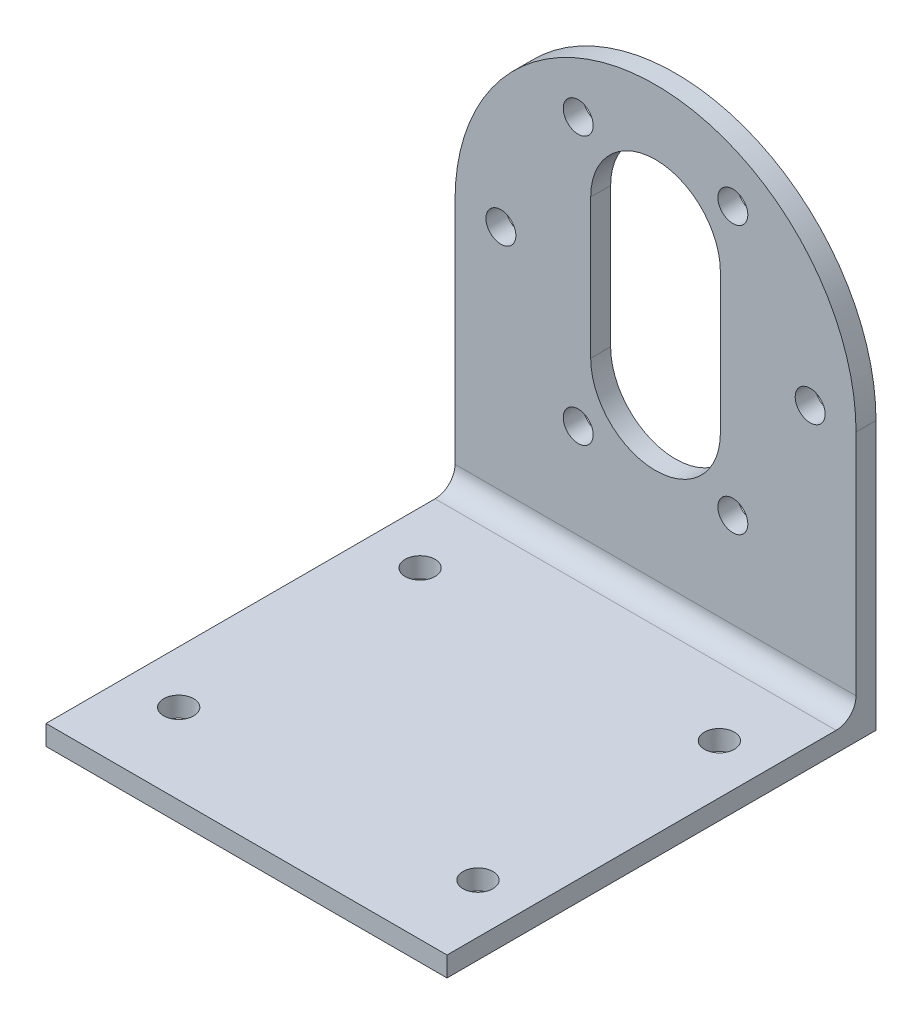
ISO-10303-21;
HEADER;
FILE_DESCRIPTION(('STEP AP214'),'2;1');
FILE_NAME('part.step','',(''),(''),'','','');
FILE_SCHEMA(('AUTOMOTIVE_DESIGN { 1 0 10303 214 1 1 1 1 }'));
ENDSEC;
DATA;
#1=APPLICATION_CONTEXT('core data for automotive mechanical design processes');
#2=APPLICATION_PROTOCOL_DEFINITION('international standard','automotive_design',2000,#1);
#3=PRODUCT_CONTEXT('',#1,'mechanical');
#4=PRODUCT('Part','Part','',(#3));
#5=PRODUCT_RELATED_PRODUCT_CATEGORY('part','',(#4));
#6=PRODUCT_DEFINITION_FORMATION('','',#4);
#7=PRODUCT_DEFINITION_CONTEXT('part definition',#1,'design');
#8=PRODUCT_DEFINITION('design','',#6,#7);
#9=PRODUCT_DEFINITION_SHAPE('','',#8);
#10=(LENGTH_UNIT() NAMED_UNIT(*) SI_UNIT(.MILLI.,.METRE.));
#11=(NAMED_UNIT(*) PLANE_ANGLE_UNIT() SI_UNIT($,.RADIAN.));
#12=(NAMED_UNIT(*) SI_UNIT($,.STERADIAN.) SOLID_ANGLE_UNIT());
#13=UNCERTAINTY_MEASURE_WITH_UNIT(LENGTH_MEASURE(1.E-05),#10,'distance_accuracy_value','');
#14=(GEOMETRIC_REPRESENTATION_CONTEXT(3) GLOBAL_UNCERTAINTY_ASSIGNED_CONTEXT((#13)) GLOBAL_UNIT_ASSIGNED_CONTEXT((#10,
#11,#12)) REPRESENTATION_CONTEXT('',''));
#15=CARTESIAN_POINT('',(0.,0.,0.));
#16=DIRECTION('',(0.,0.,1.));
#17=DIRECTION('',(1.,0.,0.));
#18=AXIS2_PLACEMENT_3D('',#15,#16,#17);
#19=CARTESIAN_POINT('',(0.,-22.9,4.));
#20=DIRECTION('',(1.,0.,0.));
#21=DIRECTION('',(0.,0.,-1.));
#22=AXIS2_PLACEMENT_3D('',#19,#20,#21);
#23=CYLINDRICAL_SURFACE('',#22,2.);
#24=DIRECTION('',(1.,0.,0.));
#25=VECTOR('',#24,1.);
#26=CARTESIAN_POINT('',(0.,-22.9,2.));
#27=LINE('',#26,#25);
#28=CARTESIAN_POINT('',(-20.1,-22.9,2.));
#29=VERTEX_POINT('',#28);
#30=CARTESIAN_POINT('',(20.1,-22.9,2.));
#31=VERTEX_POINT('',#30);
#32=EDGE_CURVE('E136',#29,#31,#27,.T.);
#33=ORIENTED_EDGE('',*,*,#32,.F.);
#34=CARTESIAN_POINT('',(-20.1,-22.9,4.));
#35=DIRECTION('',(1.,0.,0.));
#36=DIRECTION('',(0.,0.,-1.));
#37=AXIS2_PLACEMENT_3D('',#34,#35,#36);
#38=CIRCLE('',#37,2.);
#39=CARTESIAN_POINT('',(-20.1,-24.9,4.));
#40=VERTEX_POINT('',#39);
#41=EDGE_CURVE('E117',#29,#40,#38,.F.);
#42=ORIENTED_EDGE('',*,*,#41,.T.);
#43=DIRECTION('',(1.,0.,0.));
#44=VECTOR('',#43,1.);
#45=CARTESIAN_POINT('',(0.,-24.9,4.));
#46=LINE('',#45,#44);
#47=CARTESIAN_POINT('',(20.1,-24.9,4.));
#48=VERTEX_POINT('',#47);
#49=EDGE_CURVE('E122',#48,#40,#46,.F.);
#50=ORIENTED_EDGE('',*,*,#49,.F.);
#51=CARTESIAN_POINT('',(20.1,-22.9,4.));
#52=DIRECTION('',(1.,0.,0.));
#53=DIRECTION('',(0.,0.,-1.));
#54=AXIS2_PLACEMENT_3D('',#51,#52,#53);
#55=CIRCLE('',#54,2.);
#56=EDGE_CURVE('E214',#48,#31,#55,.T.);
#57=ORIENTED_EDGE('',*,*,#56,.T.);
#58=EDGE_LOOP('',(#33,#42,#50,#57));
#59=FACE_BOUND('',#58,.T.);
#60=ADVANCED_FACE('F17',(#59),#23,.F.);
#61=CARTESIAN_POINT('',(0.,0.,2.));
#62=DIRECTION('',(0.,0.,1.));
#63=DIRECTION('',(1.,0.,0.));
#64=AXIS2_PLACEMENT_3D('',#61,#62,#63);
#65=PLANE('',#64);
#66=CARTESIAN_POINT('',(7.75000000000016,13.4233937586587,2.));
#67=DIRECTION('',(0.,0.,-1.));
#68=DIRECTION('',(-1.,0.,0.));
#69=AXIS2_PLACEMENT_3D('',#66,#67,#68);
#70=CIRCLE('',#69,1.5);
#71=CARTESIAN_POINT('',(6.25000000000016,13.4233937586587,2.));
#72=VERTEX_POINT('',#71);
#73=EDGE_CURVE('E124',#72,#72,#70,.T.);
#74=ORIENTED_EDGE('',*,*,#73,.T.);
#75=EDGE_LOOP('',(#74));
#76=FACE_BOUND('',#75,.T.);
#77=CARTESIAN_POINT('',(-15.5,1.08235921504137E-13,2.));
#78=DIRECTION('',(0.,0.,-1.));
#79=DIRECTION('',(-1.,0.,0.));
#80=AXIS2_PLACEMENT_3D('',#77,#78,#79);
#81=CIRCLE('',#80,1.5);
#82=CARTESIAN_POINT('',(-17.,1.08235921504137E-13,2.));
#83=VERTEX_POINT('',#82);
#84=EDGE_CURVE('E223',#83,#83,#81,.T.);
#85=ORIENTED_EDGE('',*,*,#84,.T.);
#86=EDGE_LOOP('',(#85));
#87=FACE_BOUND('',#86,.T.);
#88=CARTESIAN_POINT('',(7.74999999999997,-13.4233937586588,2.));
#89=DIRECTION('',(0.,0.,-1.));
#90=DIRECTION('',(-1.,0.,0.));
#91=AXIS2_PLACEMENT_3D('',#88,#89,#90);
#92=CIRCLE('',#91,1.5);
#93=CARTESIAN_POINT('',(6.24999999999997,-13.4233937586588,2.));
#94=VERTEX_POINT('',#93);
#95=EDGE_CURVE('E229',#94,#94,#92,.T.);
#96=ORIENTED_EDGE('',*,*,#95,.T.);
#97=EDGE_LOOP('',(#96));
#98=FACE_BOUND('',#97,.T.);
#99=CARTESIAN_POINT('',(15.5,0.,2.));
#100=DIRECTION('',(0.,0.,-1.));
#101=DIRECTION('',(-1.,0.,0.));
#102=AXIS2_PLACEMENT_3D('',#99,#100,#101);
#103=CIRCLE('',#102,1.5);
#104=CARTESIAN_POINT('',(14.,0.,2.));
#105=VERTEX_POINT('',#104);
#106=EDGE_CURVE('E20',#105,#105,#103,.T.);
#107=ORIENTED_EDGE('',*,*,#106,.T.);
#108=EDGE_LOOP('',(#107));
#109=FACE_BOUND('',#108,.T.);
#110=DIRECTION('',(0.,1.,0.));
#111=VECTOR('',#110,1.);
#112=CARTESIAN_POINT('',(6.5,7.1,2.));
#113=LINE('',#112,#111);
#114=CARTESIAN_POINT('',(6.5,-6.9,2.));
#115=VERTEX_POINT('',#114);
#116=CARTESIAN_POINT('',(6.5,7.1,2.));
#117=VERTEX_POINT('',#116);
#118=EDGE_CURVE('E107',#115,#117,#113,.T.);
#119=ORIENTED_EDGE('',*,*,#118,.F.);
#120=CARTESIAN_POINT('',(0.,-6.9,2.));
#121=DIRECTION('',(0.,0.,-1.));
#122=DIRECTION('',(-1.,0.,0.));
#123=AXIS2_PLACEMENT_3D('',#120,#121,#122);
#124=CIRCLE('',#123,6.5);
#125=CARTESIAN_POINT('',(-6.5,-6.9,2.));
#126=VERTEX_POINT('',#125);
#127=EDGE_CURVE('E164',#115,#126,#124,.T.);
#128=ORIENTED_EDGE('',*,*,#127,.T.);
#129=DIRECTION('',(0.,1.,0.));
#130=VECTOR('',#129,1.);
#131=CARTESIAN_POINT('',(-6.5,7.1,2.));
#132=LINE('',#131,#130);
#133=CARTESIAN_POINT('',(-6.5,7.1,2.));
#134=VERTEX_POINT('',#133);
#135=EDGE_CURVE('E162',#134,#126,#132,.F.);
#136=ORIENTED_EDGE('',*,*,#135,.F.);
#137=CARTESIAN_POINT('',(0.,7.1,2.));
#138=DIRECTION('',(0.,0.,-1.));
#139=DIRECTION('',(-1.,0.,0.));
#140=AXIS2_PLACEMENT_3D('',#137,#138,#139);
#141=CIRCLE('',#140,6.5);
#142=EDGE_CURVE('E233',#134,#117,#141,.T.);
#143=ORIENTED_EDGE('',*,*,#142,.T.);
#144=EDGE_LOOP('',(#119,#128,#136,#143));
#145=FACE_BOUND('',#144,.T.);
#146=CARTESIAN_POINT('',(-7.75000000000006,-13.4233937586588,2.));
#147=DIRECTION('',(0.,0.,-1.));
#148=DIRECTION('',(-1.,0.,0.));
#149=AXIS2_PLACEMENT_3D('',#146,#147,#148);
#150=CIRCLE('',#149,1.5);
#151=CARTESIAN_POINT('',(-9.25000000000007,-13.4233937586588,2.));
#152=VERTEX_POINT('',#151);
#153=EDGE_CURVE('E226',#152,#152,#150,.T.);
#154=ORIENTED_EDGE('',*,*,#153,.T.);
#155=EDGE_LOOP('',(#154));
#156=FACE_BOUND('',#155,.T.);
#157=CARTESIAN_POINT('',(-7.74999999999988,13.4233937586589,2.));
#158=DIRECTION('',(0.,0.,-1.));
#159=DIRECTION('',(-1.,0.,0.));
#160=AXIS2_PLACEMENT_3D('',#157,#158,#159);
#161=CIRCLE('',#160,1.5);
#162=CARTESIAN_POINT('',(-9.24999999999987,13.4233937586589,2.));
#163=VERTEX_POINT('',#162);
#164=EDGE_CURVE('E220',#163,#163,#161,.T.);
#165=ORIENTED_EDGE('',*,*,#164,.T.);
#166=EDGE_LOOP('',(#165));
#167=FACE_BOUND('',#166,.T.);
#168=DIRECTION('',(0.,1.,0.));
#169=VECTOR('',#168,1.);
#170=CARTESIAN_POINT('',(20.1,-26.9,2.));
#171=LINE('',#170,#169);
#172=CARTESIAN_POINT('',(20.1,0.,2.));
#173=VERTEX_POINT('',#172);
#174=EDGE_CURVE('E103',#31,#173,#171,.T.);
#175=ORIENTED_EDGE('',*,*,#174,.T.);
#176=CARTESIAN_POINT('',(0.,0.,2.));
#177=DIRECTION('',(0.,0.,-1.));
#178=DIRECTION('',(-1.,0.,0.));
#179=AXIS2_PLACEMENT_3D('',#176,#177,#178);
#180=CIRCLE('',#179,20.1);
#181=CARTESIAN_POINT('',(-20.1,0.,2.));
#182=VERTEX_POINT('',#181);
#183=EDGE_CURVE('E98',#182,#173,#180,.T.);
#184=ORIENTED_EDGE('',*,*,#183,.F.);
#185=DIRECTION('',(0.,1.,0.));
#186=VECTOR('',#185,1.);
#187=CARTESIAN_POINT('',(-20.1,-26.9,2.));
#188=LINE('',#187,#186);
#189=EDGE_CURVE('E101',#182,#29,#188,.F.);
#190=ORIENTED_EDGE('',*,*,#189,.T.);
#191=ORIENTED_EDGE('',*,*,#32,.T.);
#192=EDGE_LOOP('',(#175,#184,#190,#191));
#193=FACE_BOUND('',#192,.T.);
#194=ADVANCED_FACE('F100',(#76,#87,#98,#109,#145,#156,#167,#193),#65,.T.);
#195=CARTESIAN_POINT('',(15.5,0.,2.));
#196=DIRECTION('',(0.,0.,-1.));
#197=DIRECTION('',(-1.,0.,0.));
#198=AXIS2_PLACEMENT_3D('',#195,#196,#197);
#199=CYLINDRICAL_SURFACE('',#198,1.5);
#200=CARTESIAN_POINT('',(15.5,0.,0.));
#201=DIRECTION('',(0.,0.,-1.));
#202=DIRECTION('',(-1.,0.,0.));
#203=AXIS2_PLACEMENT_3D('',#200,#201,#202);
#204=CIRCLE('',#203,1.5);
#205=CARTESIAN_POINT('',(14.,0.,0.));
#206=VERTEX_POINT('',#205);
#207=EDGE_CURVE('E210',#206,#206,#204,.T.);
#208=ORIENTED_EDGE('',*,*,#207,.T.);
#209=EDGE_LOOP('',(#208));
#210=FACE_BOUND('',#209,.T.);
#211=ORIENTED_EDGE('',*,*,#106,.F.);
#212=EDGE_LOOP('',(#211));
#213=FACE_BOUND('',#212,.T.);
#214=ADVANCED_FACE('F273',(#210,#213),#199,.F.);
#215=CARTESIAN_POINT('',(0.,0.,2.));
#216=DIRECTION('',(0.,0.,-1.));
#217=DIRECTION('',(-1.,0.,0.));
#218=AXIS2_PLACEMENT_3D('',#215,#216,#217);
#219=CYLINDRICAL_SURFACE('',#218,20.1);
#220=ORIENTED_EDGE('',*,*,#183,.T.);
#221=DIRECTION('',(0.,0.,1.));
#222=VECTOR('',#221,1.);
#223=CARTESIAN_POINT('',(20.1,0.,2.));
#224=LINE('',#223,#222);
#225=CARTESIAN_POINT('',(20.1,0.,0.));
#226=VERTEX_POINT('',#225);
#227=EDGE_CURVE('E142',#173,#226,#224,.F.);
#228=ORIENTED_EDGE('',*,*,#227,.T.);
#229=CARTESIAN_POINT('',(0.,0.,0.));
#230=DIRECTION('',(0.,0.,-1.));
#231=DIRECTION('',(-1.,0.,0.));
#232=AXIS2_PLACEMENT_3D('',#229,#230,#231);
#233=CIRCLE('',#232,20.1);
#234=CARTESIAN_POINT('',(-20.1,0.,0.));
#235=VERTEX_POINT('',#234);
#236=EDGE_CURVE('E121',#226,#235,#233,.F.);
#237=ORIENTED_EDGE('',*,*,#236,.T.);
#238=DIRECTION('',(0.,0.,-1.));
#239=VECTOR('',#238,1.);
#240=CARTESIAN_POINT('',(-20.1,0.,2.));
#241=LINE('',#240,#239);
#242=EDGE_CURVE('E113',#235,#182,#241,.F.);
#243=ORIENTED_EDGE('',*,*,#242,.T.);
#244=EDGE_LOOP('',(#220,#228,#237,#243));
#245=FACE_BOUND('',#244,.T.);
#246=ADVANCED_FACE('F120',(#245),#219,.T.);
#247=CARTESIAN_POINT('',(6.5,7.1,2.));
#248=DIRECTION('',(-1.,0.,0.));
#249=DIRECTION('',(0.,0.,1.));
#250=AXIS2_PLACEMENT_3D('',#247,#248,#249);
#251=PLANE('',#250);
#252=ORIENTED_EDGE('',*,*,#118,.T.);
#253=DIRECTION('',(0.,0.,-1.));
#254=VECTOR('',#253,1.);
#255=CARTESIAN_POINT('',(6.5,7.1,2.));
#256=LINE('',#255,#254);
#257=CARTESIAN_POINT('',(6.5,7.1,0.));
#258=VERTEX_POINT('',#257);
#259=EDGE_CURVE('E232',#117,#258,#256,.T.);
#260=ORIENTED_EDGE('',*,*,#259,.T.);
#261=DIRECTION('',(0.,1.,0.));
#262=VECTOR('',#261,1.);
#263=CARTESIAN_POINT('',(6.5,0.,0.));
#264=LINE('',#263,#262);
#265=CARTESIAN_POINT('',(6.5,-6.9,0.));
#266=VERTEX_POINT('',#265);
#267=EDGE_CURVE('E208',#258,#266,#264,.F.);
#268=ORIENTED_EDGE('',*,*,#267,.T.);
#269=DIRECTION('',(0.,0.,-1.));
#270=VECTOR('',#269,1.);
#271=CARTESIAN_POINT('',(6.5,-6.9,2.));
#272=LINE('',#271,#270);
#273=EDGE_CURVE('E161',#266,#115,#272,.F.);
#274=ORIENTED_EDGE('',*,*,#273,.T.);
#275=EDGE_LOOP('',(#252,#260,#268,#274));
#276=FACE_BOUND('',#275,.T.);
#277=ADVANCED_FACE('F375',(#276),#251,.T.);
#278=CARTESIAN_POINT('',(0.,-6.9,2.));
#279=DIRECTION('',(0.,0.,-1.));
#280=DIRECTION('',(-1.,0.,0.));
#281=AXIS2_PLACEMENT_3D('',#278,#279,#280);
#282=CYLINDRICAL_SURFACE('',#281,6.5);
#283=DIRECTION('',(0.,0.,-1.));
#284=VECTOR('',#283,1.);
#285=CARTESIAN_POINT('',(-6.5,-6.9,2.));
#286=LINE('',#285,#284);
#287=CARTESIAN_POINT('',(-6.5,-6.9,0.));
#288=VERTEX_POINT('',#287);
#289=EDGE_CURVE('E163',#126,#288,#286,.T.);
#290=ORIENTED_EDGE('',*,*,#289,.F.);
#291=ORIENTED_EDGE('',*,*,#127,.F.);
#292=ORIENTED_EDGE('',*,*,#273,.F.);
#293=CARTESIAN_POINT('',(0.,-6.9,0.));
#294=DIRECTION('',(0.,0.,-1.));
#295=DIRECTION('',(-1.,0.,0.));
#296=AXIS2_PLACEMENT_3D('',#293,#294,#295);
#297=CIRCLE('',#296,6.5);
#298=EDGE_CURVE('E205',#266,#288,#297,.T.);
#299=ORIENTED_EDGE('',*,*,#298,.T.);
#300=EDGE_LOOP('',(#290,#291,#292,#299));
#301=FACE_BOUND('',#300,.T.);
#302=ADVANCED_FACE('F373',(#301),#282,.F.);
#303=CARTESIAN_POINT('',(-6.5,7.1,2.));
#304=DIRECTION('',(1.,0.,0.));
#305=DIRECTION('',(0.,0.,-1.));
#306=AXIS2_PLACEMENT_3D('',#303,#304,#305);
#307=PLANE('',#306);
#308=ORIENTED_EDGE('',*,*,#135,.T.);
#309=ORIENTED_EDGE('',*,*,#289,.T.);
#310=DIRECTION('',(0.,1.,0.));
#311=VECTOR('',#310,1.);
#312=CARTESIAN_POINT('',(-6.5,0.,0.));
#313=LINE('',#312,#311);
#314=CARTESIAN_POINT('',(-6.5,7.1,0.));
#315=VERTEX_POINT('',#314);
#316=EDGE_CURVE('E204',#288,#315,#313,.T.);
#317=ORIENTED_EDGE('',*,*,#316,.T.);
#318=DIRECTION('',(0.,0.,-1.));
#319=VECTOR('',#318,1.);
#320=CARTESIAN_POINT('',(-6.5,7.1,2.));
#321=LINE('',#320,#319);
#322=EDGE_CURVE('E236',#315,#134,#321,.F.);
#323=ORIENTED_EDGE('',*,*,#322,.T.);
#324=EDGE_LOOP('',(#308,#309,#317,#323));
#325=FACE_BOUND('',#324,.T.);
#326=ADVANCED_FACE('F367',(#325),#307,.T.);
#327=CARTESIAN_POINT('',(0.,7.1,2.));
#328=DIRECTION('',(0.,0.,-1.));
#329=DIRECTION('',(-1.,0.,0.));
#330=AXIS2_PLACEMENT_3D('',#327,#328,#329);
#331=CYLINDRICAL_SURFACE('',#330,6.5);
#332=ORIENTED_EDGE('',*,*,#259,.F.);
#333=ORIENTED_EDGE('',*,*,#142,.F.);
#334=ORIENTED_EDGE('',*,*,#322,.F.);
#335=CARTESIAN_POINT('',(0.,7.1,0.));
#336=DIRECTION('',(0.,0.,-1.));
#337=DIRECTION('',(-1.,0.,0.));
#338=AXIS2_PLACEMENT_3D('',#335,#336,#337);
#339=CIRCLE('',#338,6.5);
#340=EDGE_CURVE('E201',#315,#258,#339,.T.);
#341=ORIENTED_EDGE('',*,*,#340,.T.);
#342=EDGE_LOOP('',(#332,#333,#334,#341));
#343=FACE_BOUND('',#342,.T.);
#344=ADVANCED_FACE('F381',(#343),#331,.F.);
#345=CARTESIAN_POINT('',(7.74999999999997,-13.4233937586588,2.));
#346=DIRECTION('',(0.,0.,-1.));
#347=DIRECTION('',(-1.,0.,0.));
#348=AXIS2_PLACEMENT_3D('',#345,#346,#347);
#349=CYLINDRICAL_SURFACE('',#348,1.5);
#350=CARTESIAN_POINT('',(7.74999999999997,-13.4233937586588,0.));
#351=DIRECTION('',(0.,0.,-1.));
#352=DIRECTION('',(-1.,0.,0.));
#353=AXIS2_PLACEMENT_3D('',#350,#351,#352);
#354=CIRCLE('',#353,1.5);
#355=CARTESIAN_POINT('',(6.24999999999997,-13.4233937586588,0.));
#356=VERTEX_POINT('',#355);
#357=EDGE_CURVE('E198',#356,#356,#354,.T.);
#358=ORIENTED_EDGE('',*,*,#357,.T.);
#359=EDGE_LOOP('',(#358));
#360=FACE_BOUND('',#359,.T.);
#361=ORIENTED_EDGE('',*,*,#95,.F.);
#362=EDGE_LOOP('',(#361));
#363=FACE_BOUND('',#362,.T.);
#364=ADVANCED_FACE('F419',(#360,#363),#349,.F.);
#365=CARTESIAN_POINT('',(-7.75000000000006,-13.4233937586588,2.));
#366=DIRECTION('',(0.,0.,-1.));
#367=DIRECTION('',(-1.,0.,0.));
#368=AXIS2_PLACEMENT_3D('',#365,#366,#367);
#369=CYLINDRICAL_SURFACE('',#368,1.5);
#370=CARTESIAN_POINT('',(-7.75000000000006,-13.4233937586588,0.));
#371=DIRECTION('',(0.,0.,-1.));
#372=DIRECTION('',(-1.,0.,0.));
#373=AXIS2_PLACEMENT_3D('',#370,#371,#372);
#374=CIRCLE('',#373,1.5);
#375=CARTESIAN_POINT('',(-9.25000000000007,-13.4233937586588,0.));
#376=VERTEX_POINT('',#375);
#377=EDGE_CURVE('E195',#376,#376,#374,.T.);
#378=ORIENTED_EDGE('',*,*,#377,.T.);
#379=EDGE_LOOP('',(#378));
#380=FACE_BOUND('',#379,.T.);
#381=ORIENTED_EDGE('',*,*,#153,.F.);
#382=EDGE_LOOP('',(#381));
#383=FACE_BOUND('',#382,.T.);
#384=ADVANCED_FACE('F301',(#380,#383),#369,.F.);
#385=CARTESIAN_POINT('',(-15.5,1.08235921504137E-13,2.));
#386=DIRECTION('',(0.,0.,-1.));
#387=DIRECTION('',(-1.,0.,0.));
#388=AXIS2_PLACEMENT_3D('',#385,#386,#387);
#389=CYLINDRICAL_SURFACE('',#388,1.5);
#390=CARTESIAN_POINT('',(-15.5,1.08235921504137E-13,0.));
#391=DIRECTION('',(0.,0.,-1.));
#392=DIRECTION('',(-1.,0.,0.));
#393=AXIS2_PLACEMENT_3D('',#390,#391,#392);
#394=CIRCLE('',#393,1.5);
#395=CARTESIAN_POINT('',(-17.,1.08235921504137E-13,0.));
#396=VERTEX_POINT('',#395);
#397=EDGE_CURVE('E192',#396,#396,#394,.T.);
#398=ORIENTED_EDGE('',*,*,#397,.T.);
#399=EDGE_LOOP('',(#398));
#400=FACE_BOUND('',#399,.T.);
#401=ORIENTED_EDGE('',*,*,#84,.F.);
#402=EDGE_LOOP('',(#401));
#403=FACE_BOUND('',#402,.T.);
#404=ADVANCED_FACE('F290',(#400,#403),#389,.F.);
#405=CARTESIAN_POINT('',(-7.74999999999988,13.4233937586589,2.));
#406=DIRECTION('',(0.,0.,-1.));
#407=DIRECTION('',(-1.,0.,0.));
#408=AXIS2_PLACEMENT_3D('',#405,#406,#407);
#409=CYLINDRICAL_SURFACE('',#408,1.5);
#410=CARTESIAN_POINT('',(-7.74999999999988,13.4233937586589,0.));
#411=DIRECTION('',(0.,0.,-1.));
#412=DIRECTION('',(-1.,0.,0.));
#413=AXIS2_PLACEMENT_3D('',#410,#411,#412);
#414=CIRCLE('',#413,1.5);
#415=CARTESIAN_POINT('',(-9.24999999999987,13.4233937586589,0.));
#416=VERTEX_POINT('',#415);
#417=EDGE_CURVE('E189',#416,#416,#414,.T.);
#418=ORIENTED_EDGE('',*,*,#417,.T.);
#419=EDGE_LOOP('',(#418));
#420=FACE_BOUND('',#419,.T.);
#421=ORIENTED_EDGE('',*,*,#164,.F.);
#422=EDGE_LOOP('',(#421));
#423=FACE_BOUND('',#422,.T.);
#424=ADVANCED_FACE('F287',(#420,#423),#409,.F.);
#425=CARTESIAN_POINT('',(7.75000000000016,13.4233937586587,2.));
#426=DIRECTION('',(0.,0.,-1.));
#427=DIRECTION('',(-1.,0.,0.));
#428=AXIS2_PLACEMENT_3D('',#425,#426,#427);
#429=CYLINDRICAL_SURFACE('',#428,1.5);
#430=CARTESIAN_POINT('',(7.75000000000016,13.4233937586587,0.));
#431=DIRECTION('',(0.,0.,-1.));
#432=DIRECTION('',(-1.,0.,0.));
#433=AXIS2_PLACEMENT_3D('',#430,#431,#432);
#434=CIRCLE('',#433,1.5);
#435=CARTESIAN_POINT('',(6.25000000000016,13.4233937586587,0.));
#436=VERTEX_POINT('',#435);
#437=EDGE_CURVE('E186',#436,#436,#434,.T.);
#438=ORIENTED_EDGE('',*,*,#437,.T.);
#439=EDGE_LOOP('',(#438));
#440=FACE_BOUND('',#439,.T.);
#441=ORIENTED_EDGE('',*,*,#73,.F.);
#442=EDGE_LOOP('',(#441));
#443=FACE_BOUND('',#442,.T.);
#444=ADVANCED_FACE('F289',(#440,#443),#429,.F.);
#445=CARTESIAN_POINT('',(0.,-24.9,0.));
#446=DIRECTION('',(0.,1.,0.));
#447=DIRECTION('',(0.,0.,1.));
#448=AXIS2_PLACEMENT_3D('',#445,#446,#447);
#449=PLANE('',#448);
#450=DIRECTION('',(0.,0.,-1.));
#451=VECTOR('',#450,1.);
#452=CARTESIAN_POINT('',(-20.1,-24.9,2.));
#453=LINE('',#452,#451);
#454=CARTESIAN_POINT('',(-20.1,-24.9,43.));
#455=VERTEX_POINT('',#454);
#456=EDGE_CURVE('E148',#40,#455,#453,.F.);
#457=ORIENTED_EDGE('',*,*,#456,.T.);
#458=DIRECTION('',(1.,0.,0.));
#459=VECTOR('',#458,1.);
#460=CARTESIAN_POINT('',(-20.1,-24.9,43.));
#461=LINE('',#460,#459);
#462=CARTESIAN_POINT('',(20.1,-24.9,43.));
#463=VERTEX_POINT('',#462);
#464=EDGE_CURVE('E145',#463,#455,#461,.F.);
#465=ORIENTED_EDGE('',*,*,#464,.F.);
#466=DIRECTION('',(0.,0.,1.));
#467=VECTOR('',#466,1.);
#468=CARTESIAN_POINT('',(20.1,-24.9,2.));
#469=LINE('',#468,#467);
#470=EDGE_CURVE('E141',#463,#48,#469,.F.);
#471=ORIENTED_EDGE('',*,*,#470,.T.);
#472=ORIENTED_EDGE('',*,*,#49,.T.);
#473=EDGE_LOOP('',(#457,#465,#471,#472));
#474=FACE_BOUND('',#473,.T.);
#475=CARTESIAN_POINT('',(-14.85,-24.9,34.95));
#476=DIRECTION('',(0.,-1.,0.));
#477=DIRECTION('',(0.,0.,-1.));
#478=AXIS2_PLACEMENT_3D('',#475,#476,#477);
#479=CIRCLE('',#478,1.5);
#480=CARTESIAN_POINT('',(-14.85,-24.9,33.45));
#481=VERTEX_POINT('',#480);
#482=EDGE_CURVE('E133',#481,#481,#479,.T.);
#483=ORIENTED_EDGE('',*,*,#482,.T.);
#484=EDGE_LOOP('',(#483));
#485=FACE_BOUND('',#484,.T.);
#486=CARTESIAN_POINT('',(15.15,-24.9,34.95));
#487=DIRECTION('',(0.,-1.,0.));
#488=DIRECTION('',(0.,0.,-1.));
#489=AXIS2_PLACEMENT_3D('',#486,#487,#488);
#490=CIRCLE('',#489,1.5);
#491=CARTESIAN_POINT('',(15.15,-24.9,33.45));
#492=VERTEX_POINT('',#491);
#493=EDGE_CURVE('E177',#492,#492,#490,.T.);
#494=ORIENTED_EDGE('',*,*,#493,.T.);
#495=EDGE_LOOP('',(#494));
#496=FACE_BOUND('',#495,.T.);
#497=CARTESIAN_POINT('',(15.15,-24.9,10.75));
#498=DIRECTION('',(0.,-1.,0.));
#499=DIRECTION('',(0.,0.,-1.));
#500=AXIS2_PLACEMENT_3D('',#497,#498,#499);
#501=CIRCLE('',#500,1.5);
#502=CARTESIAN_POINT('',(15.15,-24.9,9.25));
#503=VERTEX_POINT('',#502);
#504=EDGE_CURVE('E180',#503,#503,#501,.T.);
#505=ORIENTED_EDGE('',*,*,#504,.T.);
#506=EDGE_LOOP('',(#505));
#507=FACE_BOUND('',#506,.T.);
#508=CARTESIAN_POINT('',(-14.85,-24.9,10.75));
#509=DIRECTION('',(0.,-1.,0.));
#510=DIRECTION('',(0.,0.,-1.));
#511=AXIS2_PLACEMENT_3D('',#508,#509,#510);
#512=CIRCLE('',#511,1.5);
#513=CARTESIAN_POINT('',(-14.85,-24.9,9.25));
#514=VERTEX_POINT('',#513);
#515=EDGE_CURVE('E183',#514,#514,#512,.T.);
#516=ORIENTED_EDGE('',*,*,#515,.T.);
#517=EDGE_LOOP('',(#516));
#518=FACE_BOUND('',#517,.T.);
#519=ADVANCED_FACE('F298',(#474,#485,#496,#507,#518),#449,.T.);
#520=CARTESIAN_POINT('',(-20.1,-26.9,2.));
#521=DIRECTION('',(1.,0.,0.));
#522=DIRECTION('',(0.,0.,-1.));
#523=AXIS2_PLACEMENT_3D('',#520,#521,#522);
#524=PLANE('',#523);
#525=DIRECTION('',(0.,0.,1.));
#526=VECTOR('',#525,1.);
#527=CARTESIAN_POINT('',(-20.1,-26.9,2.));
#528=LINE('',#527,#526);
#529=CARTESIAN_POINT('',(-20.1,-26.9,0.));
#530=VERTEX_POINT('',#529);
#531=CARTESIAN_POINT('',(-20.1,-26.9,43.));
#532=VERTEX_POINT('',#531);
#533=EDGE_CURVE('E130',#530,#532,#528,.T.);
#534=ORIENTED_EDGE('',*,*,#533,.T.);
#535=DIRECTION('',(0.,1.,0.));
#536=VECTOR('',#535,1.);
#537=CARTESIAN_POINT('',(-20.1,-24.9,43.));
#538=LINE('',#537,#536);
#539=EDGE_CURVE('E147',#455,#532,#538,.F.);
#540=ORIENTED_EDGE('',*,*,#539,.F.);
#541=ORIENTED_EDGE('',*,*,#456,.F.);
#542=ORIENTED_EDGE('',*,*,#41,.F.);
#543=ORIENTED_EDGE('',*,*,#189,.F.);
#544=ORIENTED_EDGE('',*,*,#242,.F.);
#545=DIRECTION('',(0.,1.,0.));
#546=VECTOR('',#545,1.);
#547=CARTESIAN_POINT('',(-20.1,0.,0.));
#548=LINE('',#547,#546);
#549=EDGE_CURVE('E213',#235,#530,#548,.F.);
#550=ORIENTED_EDGE('',*,*,#549,.T.);
#551=EDGE_LOOP('',(#534,#540,#541,#542,#543,#544,#550));
#552=FACE_BOUND('',#551,.T.);
#553=ADVANCED_FACE('F111',(#552),#524,.F.);
#554=CARTESIAN_POINT('',(-20.1,-24.9,43.));
#555=DIRECTION('',(0.,0.,1.));
#556=DIRECTION('',(1.,0.,0.));
#557=AXIS2_PLACEMENT_3D('',#554,#555,#556);
#558=PLANE('',#557);
#559=ORIENTED_EDGE('',*,*,#464,.T.);
#560=ORIENTED_EDGE('',*,*,#539,.T.);
#561=DIRECTION('',(1.,0.,0.));
#562=VECTOR('',#561,1.);
#563=CARTESIAN_POINT('',(-20.1,-26.9,43.));
#564=LINE('',#563,#562);
#565=CARTESIAN_POINT('',(20.1,-26.9,43.));
#566=VERTEX_POINT('',#565);
#567=EDGE_CURVE('E132',#532,#566,#564,.T.);
#568=ORIENTED_EDGE('',*,*,#567,.T.);
#569=DIRECTION('',(0.,1.,0.));
#570=VECTOR('',#569,1.);
#571=CARTESIAN_POINT('',(20.1,-26.9,43.));
#572=LINE('',#571,#570);
#573=EDGE_CURVE('E138',#566,#463,#572,.T.);
#574=ORIENTED_EDGE('',*,*,#573,.T.);
#575=EDGE_LOOP('',(#559,#560,#568,#574));
#576=FACE_BOUND('',#575,.T.);
#577=ADVANCED_FACE('F261',(#576),#558,.T.);
#578=CARTESIAN_POINT('',(20.1,-26.9,2.));
#579=DIRECTION('',(-1.,0.,0.));
#580=DIRECTION('',(0.,0.,1.));
#581=AXIS2_PLACEMENT_3D('',#578,#579,#580);
#582=PLANE('',#581);
#583=ORIENTED_EDGE('',*,*,#56,.F.);
#584=ORIENTED_EDGE('',*,*,#470,.F.);
#585=ORIENTED_EDGE('',*,*,#573,.F.);
#586=DIRECTION('',(0.,0.,1.));
#587=VECTOR('',#586,1.);
#588=CARTESIAN_POINT('',(20.1,-26.9,2.));
#589=LINE('',#588,#587);
#590=CARTESIAN_POINT('',(20.1,-26.9,0.));
#591=VERTEX_POINT('',#590);
#592=EDGE_CURVE('E153',#566,#591,#589,.F.);
#593=ORIENTED_EDGE('',*,*,#592,.T.);
#594=DIRECTION('',(0.,1.,0.));
#595=VECTOR('',#594,1.);
#596=CARTESIAN_POINT('',(20.1,0.,0.));
#597=LINE('',#596,#595);
#598=EDGE_CURVE('E35',#591,#226,#597,.T.);
#599=ORIENTED_EDGE('',*,*,#598,.T.);
#600=ORIENTED_EDGE('',*,*,#227,.F.);
#601=ORIENTED_EDGE('',*,*,#174,.F.);
#602=EDGE_LOOP('',(#583,#584,#585,#593,#599,#600,#601));
#603=FACE_BOUND('',#602,.T.);
#604=ADVANCED_FACE('F255',(#603),#582,.F.);
#605=CARTESIAN_POINT('',(0.,0.,0.));
#606=DIRECTION('',(0.,0.,1.));
#607=DIRECTION('',(1.,0.,0.));
#608=AXIS2_PLACEMENT_3D('',#605,#606,#607);
#609=PLANE('',#608);
#610=ORIENTED_EDGE('',*,*,#437,.F.);
#611=EDGE_LOOP('',(#610));
#612=FACE_BOUND('',#611,.T.);
#613=ORIENTED_EDGE('',*,*,#417,.F.);
#614=EDGE_LOOP('',(#613));
#615=FACE_BOUND('',#614,.T.);
#616=ORIENTED_EDGE('',*,*,#397,.F.);
#617=EDGE_LOOP('',(#616));
#618=FACE_BOUND('',#617,.T.);
#619=ORIENTED_EDGE('',*,*,#377,.F.);
#620=EDGE_LOOP('',(#619));
#621=FACE_BOUND('',#620,.T.);
#622=ORIENTED_EDGE('',*,*,#357,.F.);
#623=EDGE_LOOP('',(#622));
#624=FACE_BOUND('',#623,.T.);
#625=ORIENTED_EDGE('',*,*,#316,.F.);
#626=ORIENTED_EDGE('',*,*,#298,.F.);
#627=ORIENTED_EDGE('',*,*,#267,.F.);
#628=ORIENTED_EDGE('',*,*,#340,.F.);
#629=EDGE_LOOP('',(#625,#626,#627,#628));
#630=FACE_BOUND('',#629,.T.);
#631=ORIENTED_EDGE('',*,*,#598,.F.);
#632=DIRECTION('',(1.,0.,0.));
#633=VECTOR('',#632,1.);
#634=CARTESIAN_POINT('',(-20.1,-26.9,0.));
#635=LINE('',#634,#633);
#636=EDGE_CURVE('E174',#591,#530,#635,.F.);
#637=ORIENTED_EDGE('',*,*,#636,.T.);
#638=ORIENTED_EDGE('',*,*,#549,.F.);
#639=ORIENTED_EDGE('',*,*,#236,.F.);
#640=EDGE_LOOP('',(#631,#637,#638,#639));
#641=FACE_BOUND('',#640,.T.);
#642=ORIENTED_EDGE('',*,*,#207,.F.);
#643=EDGE_LOOP('',(#642));
#644=FACE_BOUND('',#643,.T.);
#645=ADVANCED_FACE('F265',(#612,#615,#618,#621,#624,#630,#641,#644),#609,.F.);
#646=CARTESIAN_POINT('',(-14.85,-24.9,10.75));
#647=DIRECTION('',(0.,-1.,0.));
#648=DIRECTION('',(0.,0.,-1.));
#649=AXIS2_PLACEMENT_3D('',#646,#647,#648);
#650=CYLINDRICAL_SURFACE('',#649,1.5);
#651=ORIENTED_EDGE('',*,*,#515,.F.);
#652=EDGE_LOOP('',(#651));
#653=FACE_BOUND('',#652,.T.);
#654=CARTESIAN_POINT('',(-14.85,-26.9,10.75));
#655=DIRECTION('',(0.,-1.,0.));
#656=DIRECTION('',(0.,0.,-1.));
#657=AXIS2_PLACEMENT_3D('',#654,#655,#656);
#658=CIRCLE('',#657,1.5);
#659=CARTESIAN_POINT('',(-14.85,-26.9,9.25));
#660=VERTEX_POINT('',#659);
#661=EDGE_CURVE('E171',#660,#660,#658,.T.);
#662=ORIENTED_EDGE('',*,*,#661,.T.);
#663=EDGE_LOOP('',(#662));
#664=FACE_BOUND('',#663,.T.);
#665=ADVANCED_FACE('F268',(#653,#664),#650,.F.);
#666=CARTESIAN_POINT('',(15.15,-24.9,10.75));
#667=DIRECTION('',(0.,-1.,0.));
#668=DIRECTION('',(0.,0.,-1.));
#669=AXIS2_PLACEMENT_3D('',#666,#667,#668);
#670=CYLINDRICAL_SURFACE('',#669,1.5);
#671=ORIENTED_EDGE('',*,*,#504,.F.);
#672=EDGE_LOOP('',(#671));
#673=FACE_BOUND('',#672,.T.);
#674=CARTESIAN_POINT('',(15.15,-26.9,10.75));
#675=DIRECTION('',(0.,-1.,0.));
#676=DIRECTION('',(0.,0.,-1.));
#677=AXIS2_PLACEMENT_3D('',#674,#675,#676);
#678=CIRCLE('',#677,1.5);
#679=CARTESIAN_POINT('',(15.15,-26.9,9.25));
#680=VERTEX_POINT('',#679);
#681=EDGE_CURVE('E168',#680,#680,#678,.T.);
#682=ORIENTED_EDGE('',*,*,#681,.T.);
#683=EDGE_LOOP('',(#682));
#684=FACE_BOUND('',#683,.T.);
#685=ADVANCED_FACE('F319',(#673,#684),#670,.F.);
#686=CARTESIAN_POINT('',(15.15,-24.9,34.95));
#687=DIRECTION('',(0.,-1.,0.));
#688=DIRECTION('',(0.,0.,-1.));
#689=AXIS2_PLACEMENT_3D('',#686,#687,#688);
#690=CYLINDRICAL_SURFACE('',#689,1.5);
#691=ORIENTED_EDGE('',*,*,#493,.F.);
#692=EDGE_LOOP('',(#691));
#693=FACE_BOUND('',#692,.T.);
#694=CARTESIAN_POINT('',(15.15,-26.9,34.95));
#695=DIRECTION('',(0.,-1.,0.));
#696=DIRECTION('',(0.,0.,-1.));
#697=AXIS2_PLACEMENT_3D('',#694,#695,#696);
#698=CIRCLE('',#697,1.5);
#699=CARTESIAN_POINT('',(15.15,-26.9,33.45));
#700=VERTEX_POINT('',#699);
#701=EDGE_CURVE('E26',#700,#700,#698,.T.);
#702=ORIENTED_EDGE('',*,*,#701,.T.);
#703=EDGE_LOOP('',(#702));
#704=FACE_BOUND('',#703,.T.);
#705=ADVANCED_FACE('F311',(#693,#704),#690,.F.);
#706=CARTESIAN_POINT('',(-14.85,-24.9,34.95));
#707=DIRECTION('',(0.,-1.,0.));
#708=DIRECTION('',(0.,0.,-1.));
#709=AXIS2_PLACEMENT_3D('',#706,#707,#708);
#710=CYLINDRICAL_SURFACE('',#709,1.5);
#711=ORIENTED_EDGE('',*,*,#482,.F.);
#712=EDGE_LOOP('',(#711));
#713=FACE_BOUND('',#712,.T.);
#714=CARTESIAN_POINT('',(-14.85,-26.9,34.95));
#715=DIRECTION('',(0.,-1.,0.));
#716=DIRECTION('',(0.,0.,-1.));
#717=AXIS2_PLACEMENT_3D('',#714,#715,#716);
#718=CIRCLE('',#717,1.5);
#719=CARTESIAN_POINT('',(-14.85,-26.9,33.45));
#720=VERTEX_POINT('',#719);
#721=EDGE_CURVE('E11',#720,#720,#718,.T.);
#722=ORIENTED_EDGE('',*,*,#721,.T.);
#723=EDGE_LOOP('',(#722));
#724=FACE_BOUND('',#723,.T.);
#725=ADVANCED_FACE('F305',(#713,#724),#710,.F.);
#726=CARTESIAN_POINT('',(-20.1,-26.9,2.));
#727=DIRECTION('',(0.,1.,0.));
#728=DIRECTION('',(0.,0.,1.));
#729=AXIS2_PLACEMENT_3D('',#726,#727,#728);
#730=PLANE('',#729);
#731=ORIENTED_EDGE('',*,*,#721,.F.);
#732=EDGE_LOOP('',(#731));
#733=FACE_BOUND('',#732,.T.);
#734=ORIENTED_EDGE('',*,*,#701,.F.);
#735=EDGE_LOOP('',(#734));
#736=FACE_BOUND('',#735,.T.);
#737=ORIENTED_EDGE('',*,*,#681,.F.);
#738=EDGE_LOOP('',(#737));
#739=FACE_BOUND('',#738,.T.);
#740=ORIENTED_EDGE('',*,*,#661,.F.);
#741=EDGE_LOOP('',(#740));
#742=FACE_BOUND('',#741,.T.);
#743=ORIENTED_EDGE('',*,*,#592,.F.);
#744=ORIENTED_EDGE('',*,*,#567,.F.);
#745=ORIENTED_EDGE('',*,*,#533,.F.);
#746=ORIENTED_EDGE('',*,*,#636,.F.);
#747=EDGE_LOOP('',(#743,#744,#745,#746));
#748=FACE_BOUND('',#747,.T.);
#749=ADVANCED_FACE('F259',(#733,#736,#739,#742,#748),#730,.F.);
#750=CLOSED_SHELL('',(#60,#194,#214,#246,#277,#302,#326,#344,#364,#384,#404,#424,#444,#519,#553,
#577,#604,#645,#665,#685,#705,#725,#749));
#751=MANIFOLD_SOLID_BREP('B1',#750);
#752=ADVANCED_BREP_SHAPE_REPRESENTATION('',(#18,#751),#14);
#753=SHAPE_DEFINITION_REPRESENTATION(#9,#752);
ENDSEC;
END-ISO-10303-21;
